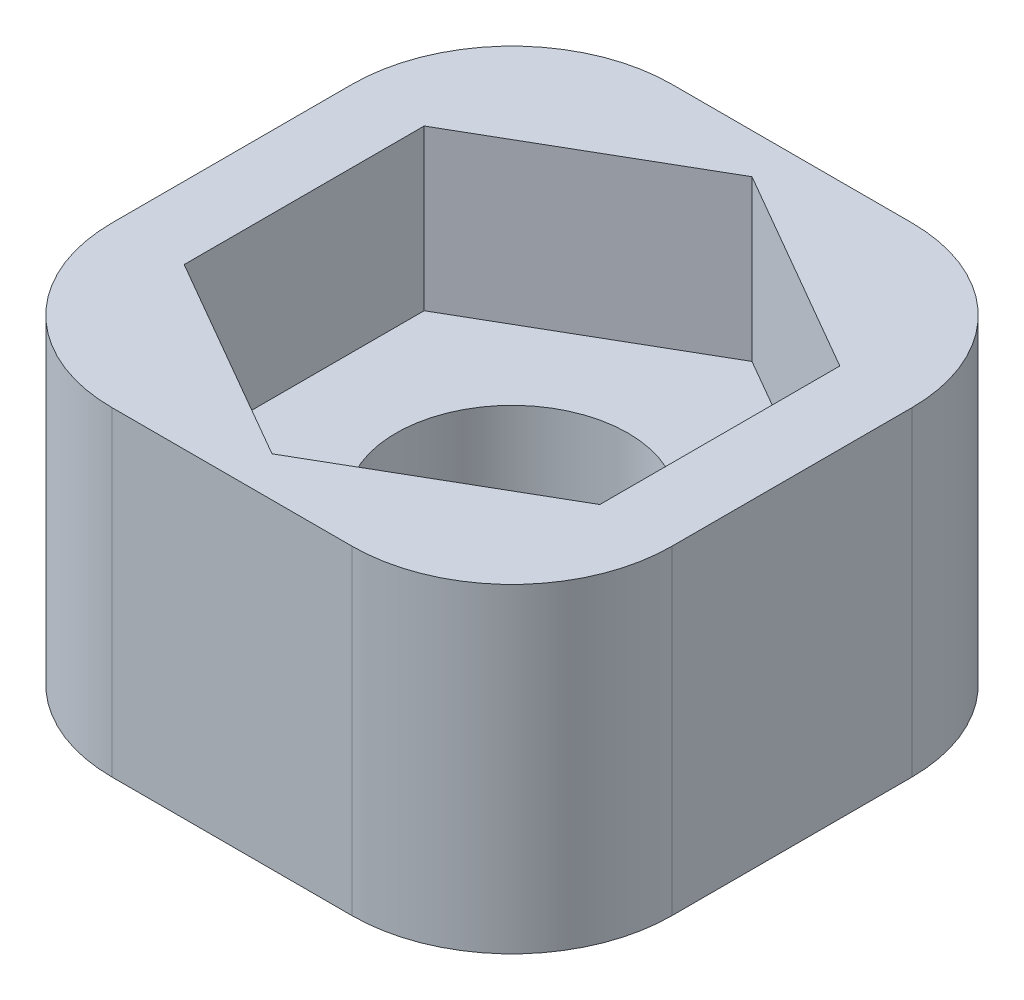
ISO-10303-21;
HEADER;
FILE_DESCRIPTION(('STEP AP214'),'2;1');
FILE_NAME('part.step','',(''),(''),'','','');
FILE_SCHEMA(('AUTOMOTIVE_DESIGN { 1 0 10303 214 1 1 1 1 }'));
ENDSEC;
DATA;
#1=APPLICATION_CONTEXT('core data for automotive mechanical design processes');
#2=APPLICATION_PROTOCOL_DEFINITION('international standard','automotive_design',2000,#1);
#3=PRODUCT_CONTEXT('',#1,'mechanical');
#4=PRODUCT('Part','Part','',(#3));
#5=PRODUCT_RELATED_PRODUCT_CATEGORY('part','',(#4));
#6=PRODUCT_DEFINITION_FORMATION('','',#4);
#7=PRODUCT_DEFINITION_CONTEXT('part definition',#1,'design');
#8=PRODUCT_DEFINITION('design','',#6,#7);
#9=PRODUCT_DEFINITION_SHAPE('','',#8);
#10=(LENGTH_UNIT() NAMED_UNIT(*) SI_UNIT(.MILLI.,.METRE.));
#11=(NAMED_UNIT(*) PLANE_ANGLE_UNIT() SI_UNIT($,.RADIAN.));
#12=(NAMED_UNIT(*) SI_UNIT($,.STERADIAN.) SOLID_ANGLE_UNIT());
#13=UNCERTAINTY_MEASURE_WITH_UNIT(LENGTH_MEASURE(1.E-05),#10,'distance_accuracy_value','');
#14=(GEOMETRIC_REPRESENTATION_CONTEXT(3) GLOBAL_UNCERTAINTY_ASSIGNED_CONTEXT((#13)) GLOBAL_UNIT_ASSIGNED_CONTEXT((#10,
#11,#12)) REPRESENTATION_CONTEXT('',''));
#15=CARTESIAN_POINT('',(0.,0.,0.));
#16=DIRECTION('',(0.,0.,1.));
#17=DIRECTION('',(1.,0.,0.));
#18=AXIS2_PLACEMENT_3D('',#15,#16,#17);
#19=CARTESIAN_POINT('',(3.5,4.,3.5));
#20=DIRECTION('',(-1.,0.,0.));
#21=DIRECTION('',(0.,0.,1.));
#22=AXIS2_PLACEMENT_3D('',#19,#20,#21);
#23=PLANE('',#22);
#24=DIRECTION('',(0.,0.,-1.));
#25=VECTOR('',#24,1.);
#26=CARTESIAN_POINT('',(3.5,4.,3.5));
#27=LINE('',#26,#25);
#28=CARTESIAN_POINT('',(3.5,4.,1.5));
#29=VERTEX_POINT('',#28);
#30=CARTESIAN_POINT('',(3.5,4.,-1.5));
#31=VERTEX_POINT('',#30);
#32=EDGE_CURVE('E207',#29,#31,#27,.T.);
#33=ORIENTED_EDGE('',*,*,#32,.F.);
#34=DIRECTION('',(0.,-1.,0.));
#35=VECTOR('',#34,1.);
#36=CARTESIAN_POINT('',(3.5,4.,1.5));
#37=LINE('',#36,#35);
#38=CARTESIAN_POINT('',(3.5,0.,1.5));
#39=VERTEX_POINT('',#38);
#40=EDGE_CURVE('E229',#29,#39,#37,.T.);
#41=ORIENTED_EDGE('',*,*,#40,.T.);
#42=DIRECTION('',(0.,0.,-1.));
#43=VECTOR('',#42,1.);
#44=CARTESIAN_POINT('',(3.5,0.,3.5));
#45=LINE('',#44,#43);
#46=CARTESIAN_POINT('',(3.5,0.,-1.5));
#47=VERTEX_POINT('',#46);
#48=EDGE_CURVE('E199',#39,#47,#45,.T.);
#49=ORIENTED_EDGE('',*,*,#48,.T.);
#50=DIRECTION('',(0.,-1.,0.));
#51=VECTOR('',#50,1.);
#52=CARTESIAN_POINT('',(3.5,4.,-1.5));
#53=LINE('',#52,#51);
#54=EDGE_CURVE('E218',#47,#31,#53,.F.);
#55=ORIENTED_EDGE('',*,*,#54,.T.);
#56=EDGE_LOOP('',(#33,#41,#49,#55));
#57=FACE_BOUND('',#56,.T.);
#58=ADVANCED_FACE('F43',(#57),#23,.F.);
#59=CARTESIAN_POINT('',(-3.5,4.,-3.5));
#60=DIRECTION('',(0.,0.,1.));
#61=DIRECTION('',(1.,0.,0.));
#62=AXIS2_PLACEMENT_3D('',#59,#60,#61);
#63=PLANE('',#62);
#64=DIRECTION('',(-1.,0.,0.));
#65=VECTOR('',#64,1.);
#66=CARTESIAN_POINT('',(-3.5,0.,-3.5));
#67=LINE('',#66,#65);
#68=CARTESIAN_POINT('',(1.5,0.,-3.5));
#69=VERTEX_POINT('',#68);
#70=CARTESIAN_POINT('',(-1.5,0.,-3.5));
#71=VERTEX_POINT('',#70);
#72=EDGE_CURVE('E221',#69,#71,#67,.T.);
#73=ORIENTED_EDGE('',*,*,#72,.T.);
#74=DIRECTION('',(0.,-1.,0.));
#75=VECTOR('',#74,1.);
#76=CARTESIAN_POINT('',(-1.5,4.,-3.5));
#77=LINE('',#76,#75);
#78=CARTESIAN_POINT('',(-1.5,4.,-3.5));
#79=VERTEX_POINT('',#78);
#80=EDGE_CURVE('E11',#71,#79,#77,.F.);
#81=ORIENTED_EDGE('',*,*,#80,.T.);
#82=DIRECTION('',(-1.,0.,0.));
#83=VECTOR('',#82,1.);
#84=CARTESIAN_POINT('',(-3.5,4.,-3.5));
#85=LINE('',#84,#83);
#86=CARTESIAN_POINT('',(1.5,4.,-3.5));
#87=VERTEX_POINT('',#86);
#88=EDGE_CURVE('E210',#87,#79,#85,.T.);
#89=ORIENTED_EDGE('',*,*,#88,.F.);
#90=DIRECTION('',(0.,-1.,0.));
#91=VECTOR('',#90,1.);
#92=CARTESIAN_POINT('',(1.5,4.,-3.5));
#93=LINE('',#92,#91);
#94=EDGE_CURVE('E51',#87,#69,#93,.T.);
#95=ORIENTED_EDGE('',*,*,#94,.T.);
#96=EDGE_LOOP('',(#73,#81,#89,#95));
#97=FACE_BOUND('',#96,.T.);
#98=ADVANCED_FACE('F260',(#97),#63,.F.);
#99=CARTESIAN_POINT('',(-3.5,4.,3.5));
#100=DIRECTION('',(1.,0.,0.));
#101=DIRECTION('',(0.,0.,-1.));
#102=AXIS2_PLACEMENT_3D('',#99,#100,#101);
#103=PLANE('',#102);
#104=DIRECTION('',(0.,0.,1.));
#105=VECTOR('',#104,1.);
#106=CARTESIAN_POINT('',(-3.5,0.,3.5));
#107=LINE('',#106,#105);
#108=CARTESIAN_POINT('',(-3.5,0.,-1.5));
#109=VERTEX_POINT('',#108);
#110=CARTESIAN_POINT('',(-3.5,0.,1.5));
#111=VERTEX_POINT('',#110);
#112=EDGE_CURVE('E224',#109,#111,#107,.T.);
#113=ORIENTED_EDGE('',*,*,#112,.T.);
#114=DIRECTION('',(0.,-1.,0.));
#115=VECTOR('',#114,1.);
#116=CARTESIAN_POINT('',(-3.5,4.,1.5));
#117=LINE('',#116,#115);
#118=CARTESIAN_POINT('',(-3.5,4.,1.5));
#119=VERTEX_POINT('',#118);
#120=EDGE_CURVE('E58',#111,#119,#117,.F.);
#121=ORIENTED_EDGE('',*,*,#120,.T.);
#122=DIRECTION('',(0.,0.,1.));
#123=VECTOR('',#122,1.);
#124=CARTESIAN_POINT('',(-3.5,4.,3.5));
#125=LINE('',#124,#123);
#126=CARTESIAN_POINT('',(-3.5,4.,-1.5));
#127=VERTEX_POINT('',#126);
#128=EDGE_CURVE('E213',#127,#119,#125,.T.);
#129=ORIENTED_EDGE('',*,*,#128,.F.);
#130=DIRECTION('',(0.,-1.,0.));
#131=VECTOR('',#130,1.);
#132=CARTESIAN_POINT('',(-3.5,4.,-1.5));
#133=LINE('',#132,#131);
#134=EDGE_CURVE('E252',#127,#109,#133,.T.);
#135=ORIENTED_EDGE('',*,*,#134,.T.);
#136=EDGE_LOOP('',(#113,#121,#129,#135));
#137=FACE_BOUND('',#136,.T.);
#138=ADVANCED_FACE('F271',(#137),#103,.F.);
#139=CARTESIAN_POINT('',(-3.5,4.,3.5));
#140=DIRECTION('',(0.,0.,-1.));
#141=DIRECTION('',(-1.,0.,0.));
#142=AXIS2_PLACEMENT_3D('',#139,#140,#141);
#143=PLANE('',#142);
#144=DIRECTION('',(1.,0.,0.));
#145=VECTOR('',#144,1.);
#146=CARTESIAN_POINT('',(-3.5,0.,3.5));
#147=LINE('',#146,#145);
#148=CARTESIAN_POINT('',(-1.5,0.,3.5));
#149=VERTEX_POINT('',#148);
#150=CARTESIAN_POINT('',(1.5,0.,3.5));
#151=VERTEX_POINT('',#150);
#152=EDGE_CURVE('E211',#149,#151,#147,.T.);
#153=ORIENTED_EDGE('',*,*,#152,.T.);
#154=DIRECTION('',(0.,-1.,0.));
#155=VECTOR('',#154,1.);
#156=CARTESIAN_POINT('',(1.5,4.,3.5));
#157=LINE('',#156,#155);
#158=CARTESIAN_POINT('',(1.5,4.,3.5));
#159=VERTEX_POINT('',#158);
#160=EDGE_CURVE('E243',#151,#159,#157,.F.);
#161=ORIENTED_EDGE('',*,*,#160,.T.);
#162=DIRECTION('',(1.,0.,0.));
#163=VECTOR('',#162,1.);
#164=CARTESIAN_POINT('',(-3.5,4.,3.5));
#165=LINE('',#164,#163);
#166=CARTESIAN_POINT('',(-1.5,4.,3.5));
#167=VERTEX_POINT('',#166);
#168=EDGE_CURVE('E215',#167,#159,#165,.T.);
#169=ORIENTED_EDGE('',*,*,#168,.F.);
#170=DIRECTION('',(0.,-1.,0.));
#171=VECTOR('',#170,1.);
#172=CARTESIAN_POINT('',(-1.5,4.,3.5));
#173=LINE('',#172,#171);
#174=EDGE_CURVE('E240',#167,#149,#173,.T.);
#175=ORIENTED_EDGE('',*,*,#174,.T.);
#176=EDGE_LOOP('',(#153,#161,#169,#175));
#177=FACE_BOUND('',#176,.T.);
#178=ADVANCED_FACE('F280',(#177),#143,.F.);
#179=CARTESIAN_POINT('',(0.,4.,0.));
#180=DIRECTION('',(0.,-1.,0.));
#181=DIRECTION('',(0.,0.,-1.));
#182=AXIS2_PLACEMENT_3D('',#179,#180,#181);
#183=PLANE('',#182);
#184=DIRECTION('',(0.,0.,-1.));
#185=VECTOR('',#184,1.);
#186=CARTESIAN_POINT('',(2.59807621135332,4.,1.5));
#187=LINE('',#186,#185);
#188=CARTESIAN_POINT('',(2.59807621135332,4.,1.5));
#189=VERTEX_POINT('',#188);
#190=CARTESIAN_POINT('',(2.59807621135332,4.,-1.5));
#191=VERTEX_POINT('',#190);
#192=EDGE_CURVE('E187',#189,#191,#187,.T.);
#193=ORIENTED_EDGE('',*,*,#192,.F.);
#194=DIRECTION('',(0.866025403784439,0.,-0.5));
#195=VECTOR('',#194,1.);
#196=CARTESIAN_POINT('',(0.,4.,3.));
#197=LINE('',#196,#195);
#198=CARTESIAN_POINT('',(0.,4.,3.));
#199=VERTEX_POINT('',#198);
#200=EDGE_CURVE('E152',#199,#189,#197,.T.);
#201=ORIENTED_EDGE('',*,*,#200,.F.);
#202=DIRECTION('',(0.866025403784439,0.,0.5));
#203=VECTOR('',#202,1.);
#204=CARTESIAN_POINT('',(-2.59807621135332,4.,1.5));
#205=LINE('',#204,#203);
#206=CARTESIAN_POINT('',(-2.59807621135332,4.,1.5));
#207=VERTEX_POINT('',#206);
#208=EDGE_CURVE('E170',#207,#199,#205,.T.);
#209=ORIENTED_EDGE('',*,*,#208,.F.);
#210=DIRECTION('',(0.,0.,1.));
#211=VECTOR('',#210,1.);
#212=CARTESIAN_POINT('',(-2.59807621135332,4.,-1.5));
#213=LINE('',#212,#211);
#214=CARTESIAN_POINT('',(-2.59807621135332,4.,-1.5));
#215=VERTEX_POINT('',#214);
#216=EDGE_CURVE('E173',#215,#207,#213,.T.);
#217=ORIENTED_EDGE('',*,*,#216,.F.);
#218=DIRECTION('',(-0.866025403784439,0.,0.5));
#219=VECTOR('',#218,1.);
#220=CARTESIAN_POINT('',(0.,4.,-3.));
#221=LINE('',#220,#219);
#222=CARTESIAN_POINT('',(0.,4.,-3.));
#223=VERTEX_POINT('',#222);
#224=EDGE_CURVE('E192',#223,#215,#221,.T.);
#225=ORIENTED_EDGE('',*,*,#224,.F.);
#226=DIRECTION('',(-0.866025403784439,0.,-0.5));
#227=VECTOR('',#226,1.);
#228=CARTESIAN_POINT('',(2.59807621135332,4.,-1.5));
#229=LINE('',#228,#227);
#230=EDGE_CURVE('E189',#191,#223,#229,.T.);
#231=ORIENTED_EDGE('',*,*,#230,.F.);
#232=EDGE_LOOP('',(#193,#201,#209,#217,#225,#231));
#233=FACE_BOUND('',#232,.T.);
#234=ORIENTED_EDGE('',*,*,#168,.T.);
#235=CARTESIAN_POINT('',(1.5,4.,1.5));
#236=DIRECTION('',(0.,-1.,0.));
#237=DIRECTION('',(0.,0.,-1.));
#238=AXIS2_PLACEMENT_3D('',#235,#236,#237);
#239=CIRCLE('',#238,2.);
#240=EDGE_CURVE('E250',#159,#29,#239,.F.);
#241=ORIENTED_EDGE('',*,*,#240,.T.);
#242=ORIENTED_EDGE('',*,*,#32,.T.);
#243=CARTESIAN_POINT('',(1.5,4.,-1.5));
#244=DIRECTION('',(0.,-1.,0.));
#245=DIRECTION('',(0.,0.,-1.));
#246=AXIS2_PLACEMENT_3D('',#243,#244,#245);
#247=CIRCLE('',#246,2.);
#248=EDGE_CURVE('E245',#31,#87,#247,.F.);
#249=ORIENTED_EDGE('',*,*,#248,.T.);
#250=ORIENTED_EDGE('',*,*,#88,.T.);
#251=CARTESIAN_POINT('',(-1.5,4.,-1.5));
#252=DIRECTION('',(0.,-1.,0.));
#253=DIRECTION('',(0.,0.,-1.));
#254=AXIS2_PLACEMENT_3D('',#251,#252,#253);
#255=CIRCLE('',#254,2.);
#256=EDGE_CURVE('E65',#79,#127,#255,.F.);
#257=ORIENTED_EDGE('',*,*,#256,.T.);
#258=ORIENTED_EDGE('',*,*,#128,.T.);
#259=CARTESIAN_POINT('',(-1.5,4.,1.5));
#260=DIRECTION('',(0.,-1.,0.));
#261=DIRECTION('',(0.,0.,-1.));
#262=AXIS2_PLACEMENT_3D('',#259,#260,#261);
#263=CIRCLE('',#262,2.);
#264=EDGE_CURVE('E248',#119,#167,#263,.F.);
#265=ORIENTED_EDGE('',*,*,#264,.T.);
#266=EDGE_LOOP('',(#234,#241,#242,#249,#250,#257,#258,#265));
#267=FACE_BOUND('',#266,.T.);
#268=ADVANCED_FACE('F273',(#233,#267),#183,.F.);
#269=CARTESIAN_POINT('',(0.,0.,0.));
#270=DIRECTION('',(0.,-1.,0.));
#271=DIRECTION('',(0.,0.,-1.));
#272=AXIS2_PLACEMENT_3D('',#269,#270,#271);
#273=PLANE('',#272);
#274=CARTESIAN_POINT('',(0.,0.,0.));
#275=DIRECTION('',(0.,-1.,0.));
#276=DIRECTION('',(0.,0.,-1.));
#277=AXIS2_PLACEMENT_3D('',#274,#275,#276);
#278=CIRCLE('',#277,1.45);
#279=CARTESIAN_POINT('',(0.,0.,-1.45));
#280=VERTEX_POINT('',#279);
#281=EDGE_CURVE('E176',#280,#280,#278,.F.);
#282=ORIENTED_EDGE('',*,*,#281,.T.);
#283=EDGE_LOOP('',(#282));
#284=FACE_BOUND('',#283,.T.);
#285=ORIENTED_EDGE('',*,*,#48,.F.);
#286=CARTESIAN_POINT('',(1.5,0.,1.5));
#287=DIRECTION('',(0.,-1.,0.));
#288=DIRECTION('',(0.,0.,-1.));
#289=AXIS2_PLACEMENT_3D('',#286,#287,#288);
#290=CIRCLE('',#289,2.);
#291=EDGE_CURVE('E238',#39,#151,#290,.T.);
#292=ORIENTED_EDGE('',*,*,#291,.T.);
#293=ORIENTED_EDGE('',*,*,#152,.F.);
#294=CARTESIAN_POINT('',(-1.5,0.,1.5));
#295=DIRECTION('',(0.,-1.,0.));
#296=DIRECTION('',(0.,0.,-1.));
#297=AXIS2_PLACEMENT_3D('',#294,#295,#296);
#298=CIRCLE('',#297,2.);
#299=EDGE_CURVE('E236',#149,#111,#298,.T.);
#300=ORIENTED_EDGE('',*,*,#299,.T.);
#301=ORIENTED_EDGE('',*,*,#112,.F.);
#302=CARTESIAN_POINT('',(-1.5,0.,-1.5));
#303=DIRECTION('',(0.,-1.,0.));
#304=DIRECTION('',(0.,0.,-1.));
#305=AXIS2_PLACEMENT_3D('',#302,#303,#304);
#306=CIRCLE('',#305,2.);
#307=EDGE_CURVE('E234',#109,#71,#306,.T.);
#308=ORIENTED_EDGE('',*,*,#307,.T.);
#309=ORIENTED_EDGE('',*,*,#72,.F.);
#310=CARTESIAN_POINT('',(1.5,0.,-1.5));
#311=DIRECTION('',(0.,-1.,0.));
#312=DIRECTION('',(0.,0.,-1.));
#313=AXIS2_PLACEMENT_3D('',#310,#311,#312);
#314=CIRCLE('',#313,2.);
#315=EDGE_CURVE('E232',#69,#47,#314,.T.);
#316=ORIENTED_EDGE('',*,*,#315,.T.);
#317=EDGE_LOOP('',(#285,#292,#293,#300,#301,#308,#309,#316));
#318=FACE_BOUND('',#317,.T.);
#319=ADVANCED_FACE('F266',(#284,#318),#273,.T.);
#320=CARTESIAN_POINT('',(0.,2.,3.));
#321=DIRECTION('',(0.5,0.,0.866025403784439));
#322=DIRECTION('',(0.866025403784439,0.,-0.5));
#323=AXIS2_PLACEMENT_3D('',#320,#321,#322);
#324=PLANE('',#323);
#325=ORIENTED_EDGE('',*,*,#200,.T.);
#326=DIRECTION('',(0.,1.,0.));
#327=VECTOR('',#326,1.);
#328=CARTESIAN_POINT('',(2.59807621135332,2.,1.5));
#329=LINE('',#328,#327);
#330=CARTESIAN_POINT('',(2.59807621135332,2.,1.5));
#331=VERTEX_POINT('',#330);
#332=EDGE_CURVE('E145',#331,#189,#329,.T.);
#333=ORIENTED_EDGE('',*,*,#332,.F.);
#334=DIRECTION('',(0.866025403784439,0.,-0.5));
#335=VECTOR('',#334,1.);
#336=CARTESIAN_POINT('',(0.,2.,3.));
#337=LINE('',#336,#335);
#338=CARTESIAN_POINT('',(0.,2.,3.));
#339=VERTEX_POINT('',#338);
#340=EDGE_CURVE('E149',#339,#331,#337,.T.);
#341=ORIENTED_EDGE('',*,*,#340,.F.);
#342=DIRECTION('',(0.,1.,0.));
#343=VECTOR('',#342,1.);
#344=CARTESIAN_POINT('',(0.,2.,3.));
#345=LINE('',#344,#343);
#346=EDGE_CURVE('E197',#339,#199,#345,.T.);
#347=ORIENTED_EDGE('',*,*,#346,.T.);
#348=EDGE_LOOP('',(#325,#333,#341,#347));
#349=FACE_BOUND('',#348,.T.);
#350=ADVANCED_FACE('F147',(#349),#324,.F.);
#351=CARTESIAN_POINT('',(-2.59807621135332,2.,1.5));
#352=DIRECTION('',(-0.5,0.,0.866025403784439));
#353=DIRECTION('',(0.866025403784439,0.,0.5));
#354=AXIS2_PLACEMENT_3D('',#351,#352,#353);
#355=PLANE('',#354);
#356=ORIENTED_EDGE('',*,*,#208,.T.);
#357=ORIENTED_EDGE('',*,*,#346,.F.);
#358=DIRECTION('',(0.866025403784439,0.,0.5));
#359=VECTOR('',#358,1.);
#360=CARTESIAN_POINT('',(-2.59807621135332,2.,1.5));
#361=LINE('',#360,#359);
#362=CARTESIAN_POINT('',(-2.59807621135332,2.,1.5));
#363=VERTEX_POINT('',#362);
#364=EDGE_CURVE('E157',#363,#339,#361,.T.);
#365=ORIENTED_EDGE('',*,*,#364,.F.);
#366=DIRECTION('',(0.,1.,0.));
#367=VECTOR('',#366,1.);
#368=CARTESIAN_POINT('',(-2.59807621135332,2.,1.5));
#369=LINE('',#368,#367);
#370=EDGE_CURVE('E200',#363,#207,#369,.T.);
#371=ORIENTED_EDGE('',*,*,#370,.T.);
#372=EDGE_LOOP('',(#356,#357,#365,#371));
#373=FACE_BOUND('',#372,.T.);
#374=ADVANCED_FACE('F375',(#373),#355,.F.);
#375=CARTESIAN_POINT('',(-2.59807621135332,2.,-1.5));
#376=DIRECTION('',(-1.,0.,0.));
#377=DIRECTION('',(0.,0.,1.));
#378=AXIS2_PLACEMENT_3D('',#375,#376,#377);
#379=PLANE('',#378);
#380=ORIENTED_EDGE('',*,*,#216,.T.);
#381=ORIENTED_EDGE('',*,*,#370,.F.);
#382=DIRECTION('',(0.,0.,1.));
#383=VECTOR('',#382,1.);
#384=CARTESIAN_POINT('',(-2.59807621135332,2.,-1.5));
#385=LINE('',#384,#383);
#386=CARTESIAN_POINT('',(-2.59807621135332,2.,-1.5));
#387=VERTEX_POINT('',#386);
#388=EDGE_CURVE('E183',#387,#363,#385,.T.);
#389=ORIENTED_EDGE('',*,*,#388,.F.);
#390=DIRECTION('',(0.,1.,0.));
#391=VECTOR('',#390,1.);
#392=CARTESIAN_POINT('',(-2.59807621135332,2.,-1.5));
#393=LINE('',#392,#391);
#394=EDGE_CURVE('E202',#387,#215,#393,.T.);
#395=ORIENTED_EDGE('',*,*,#394,.T.);
#396=EDGE_LOOP('',(#380,#381,#389,#395));
#397=FACE_BOUND('',#396,.T.);
#398=ADVANCED_FACE('F366',(#397),#379,.F.);
#399=CARTESIAN_POINT('',(0.,2.,-3.));
#400=DIRECTION('',(-0.5,0.,-0.866025403784439));
#401=DIRECTION('',(-0.866025403784439,0.,0.5));
#402=AXIS2_PLACEMENT_3D('',#399,#400,#401);
#403=PLANE('',#402);
#404=ORIENTED_EDGE('',*,*,#224,.T.);
#405=ORIENTED_EDGE('',*,*,#394,.F.);
#406=DIRECTION('',(-0.866025403784439,0.,0.5));
#407=VECTOR('',#406,1.);
#408=CARTESIAN_POINT('',(0.,2.,-3.));
#409=LINE('',#408,#407);
#410=CARTESIAN_POINT('',(0.,2.,-3.));
#411=VERTEX_POINT('',#410);
#412=EDGE_CURVE('E180',#411,#387,#409,.T.);
#413=ORIENTED_EDGE('',*,*,#412,.F.);
#414=DIRECTION('',(0.,1.,0.));
#415=VECTOR('',#414,1.);
#416=CARTESIAN_POINT('',(0.,2.,-3.));
#417=LINE('',#416,#415);
#418=EDGE_CURVE('E204',#411,#223,#417,.T.);
#419=ORIENTED_EDGE('',*,*,#418,.T.);
#420=EDGE_LOOP('',(#404,#405,#413,#419));
#421=FACE_BOUND('',#420,.T.);
#422=ADVANCED_FACE('F357',(#421),#403,.F.);
#423=CARTESIAN_POINT('',(2.59807621135332,2.,-1.5));
#424=DIRECTION('',(0.5,0.,-0.866025403784439));
#425=DIRECTION('',(-0.866025403784439,0.,-0.5));
#426=AXIS2_PLACEMENT_3D('',#423,#424,#425);
#427=PLANE('',#426);
#428=ORIENTED_EDGE('',*,*,#230,.T.);
#429=ORIENTED_EDGE('',*,*,#418,.F.);
#430=DIRECTION('',(-0.866025403784439,0.,-0.5));
#431=VECTOR('',#430,1.);
#432=CARTESIAN_POINT('',(2.59807621135332,2.,-1.5));
#433=LINE('',#432,#431);
#434=CARTESIAN_POINT('',(2.59807621135332,2.,-1.5));
#435=VERTEX_POINT('',#434);
#436=EDGE_CURVE('E165',#435,#411,#433,.T.);
#437=ORIENTED_EDGE('',*,*,#436,.F.);
#438=DIRECTION('',(0.,1.,0.));
#439=VECTOR('',#438,1.);
#440=CARTESIAN_POINT('',(2.59807621135332,2.,-1.5));
#441=LINE('',#440,#439);
#442=EDGE_CURVE('E156',#435,#191,#441,.T.);
#443=ORIENTED_EDGE('',*,*,#442,.T.);
#444=EDGE_LOOP('',(#428,#429,#437,#443));
#445=FACE_BOUND('',#444,.T.);
#446=ADVANCED_FACE('F349',(#445),#427,.F.);
#447=CARTESIAN_POINT('',(2.59807621135332,2.,1.5));
#448=DIRECTION('',(1.,0.,0.));
#449=DIRECTION('',(0.,0.,-1.));
#450=AXIS2_PLACEMENT_3D('',#447,#448,#449);
#451=PLANE('',#450);
#452=ORIENTED_EDGE('',*,*,#192,.T.);
#453=ORIENTED_EDGE('',*,*,#442,.F.);
#454=DIRECTION('',(0.,0.,-1.));
#455=VECTOR('',#454,1.);
#456=CARTESIAN_POINT('',(2.59807621135332,2.,1.5));
#457=LINE('',#456,#455);
#458=EDGE_CURVE('E160',#331,#435,#457,.T.);
#459=ORIENTED_EDGE('',*,*,#458,.F.);
#460=ORIENTED_EDGE('',*,*,#332,.T.);
#461=EDGE_LOOP('',(#452,#453,#459,#460));
#462=FACE_BOUND('',#461,.T.);
#463=ADVANCED_FACE('F161',(#462),#451,.F.);
#464=CARTESIAN_POINT('',(0.,2.,0.));
#465=DIRECTION('',(0.,1.,0.));
#466=DIRECTION('',(0.,0.,1.));
#467=AXIS2_PLACEMENT_3D('',#464,#465,#466);
#468=PLANE('',#467);
#469=CARTESIAN_POINT('',(0.,2.,0.));
#470=DIRECTION('',(0.,1.,0.));
#471=DIRECTION('',(0.,0.,1.));
#472=AXIS2_PLACEMENT_3D('',#469,#470,#471);
#473=CIRCLE('',#472,1.45);
#474=CARTESIAN_POINT('',(0.,2.,1.45));
#475=VERTEX_POINT('',#474);
#476=EDGE_CURVE('E445',#475,#475,#473,.T.);
#477=ORIENTED_EDGE('',*,*,#476,.F.);
#478=EDGE_LOOP('',(#477));
#479=FACE_BOUND('',#478,.T.);
#480=ORIENTED_EDGE('',*,*,#340,.T.);
#481=ORIENTED_EDGE('',*,*,#458,.T.);
#482=ORIENTED_EDGE('',*,*,#436,.T.);
#483=ORIENTED_EDGE('',*,*,#412,.T.);
#484=ORIENTED_EDGE('',*,*,#388,.T.);
#485=ORIENTED_EDGE('',*,*,#364,.T.);
#486=EDGE_LOOP('',(#480,#481,#482,#483,#484,#485));
#487=FACE_BOUND('',#486,.T.);
#488=ADVANCED_FACE('F167',(#479,#487),#468,.T.);
#489=CARTESIAN_POINT('',(0.,-4.10121933088197,0.));
#490=DIRECTION('',(0.,1.,0.));
#491=DIRECTION('',(0.,0.,1.));
#492=AXIS2_PLACEMENT_3D('',#489,#490,#491);
#493=CYLINDRICAL_SURFACE('',#492,1.45);
#494=ORIENTED_EDGE('',*,*,#476,.T.);
#495=EDGE_LOOP('',(#494));
#496=FACE_BOUND('',#495,.T.);
#497=ORIENTED_EDGE('',*,*,#281,.F.);
#498=EDGE_LOOP('',(#497));
#499=FACE_BOUND('',#498,.T.);
#500=ADVANCED_FACE('F304',(#496,#499),#493,.F.);
#501=CARTESIAN_POINT('',(1.5,4.,1.5));
#502=DIRECTION('',(0.,-1.,0.));
#503=DIRECTION('',(0.,0.,-1.));
#504=AXIS2_PLACEMENT_3D('',#501,#502,#503);
#505=CYLINDRICAL_SURFACE('',#504,2.);
#506=ORIENTED_EDGE('',*,*,#240,.F.);
#507=ORIENTED_EDGE('',*,*,#160,.F.);
#508=ORIENTED_EDGE('',*,*,#291,.F.);
#509=ORIENTED_EDGE('',*,*,#40,.F.);
#510=EDGE_LOOP('',(#506,#507,#508,#509));
#511=FACE_BOUND('',#510,.T.);
#512=ADVANCED_FACE('F285',(#511),#505,.T.);
#513=CARTESIAN_POINT('',(-1.5,4.,1.5));
#514=DIRECTION('',(0.,-1.,0.));
#515=DIRECTION('',(0.,0.,-1.));
#516=AXIS2_PLACEMENT_3D('',#513,#514,#515);
#517=CYLINDRICAL_SURFACE('',#516,2.);
#518=ORIENTED_EDGE('',*,*,#264,.F.);
#519=ORIENTED_EDGE('',*,*,#120,.F.);
#520=ORIENTED_EDGE('',*,*,#299,.F.);
#521=ORIENTED_EDGE('',*,*,#174,.F.);
#522=EDGE_LOOP('',(#518,#519,#520,#521));
#523=FACE_BOUND('',#522,.T.);
#524=ADVANCED_FACE('F277',(#523),#517,.T.);
#525=CARTESIAN_POINT('',(-1.5,4.,-1.5));
#526=DIRECTION('',(0.,-1.,0.));
#527=DIRECTION('',(0.,0.,-1.));
#528=AXIS2_PLACEMENT_3D('',#525,#526,#527);
#529=CYLINDRICAL_SURFACE('',#528,2.);
#530=ORIENTED_EDGE('',*,*,#256,.F.);
#531=ORIENTED_EDGE('',*,*,#80,.F.);
#532=ORIENTED_EDGE('',*,*,#307,.F.);
#533=ORIENTED_EDGE('',*,*,#134,.F.);
#534=EDGE_LOOP('',(#530,#531,#532,#533));
#535=FACE_BOUND('',#534,.T.);
#536=ADVANCED_FACE('F270',(#535),#529,.T.);
#537=CARTESIAN_POINT('',(1.5,4.,-1.5));
#538=DIRECTION('',(0.,-1.,0.));
#539=DIRECTION('',(0.,0.,-1.));
#540=AXIS2_PLACEMENT_3D('',#537,#538,#539);
#541=CYLINDRICAL_SURFACE('',#540,2.);
#542=ORIENTED_EDGE('',*,*,#248,.F.);
#543=ORIENTED_EDGE('',*,*,#54,.F.);
#544=ORIENTED_EDGE('',*,*,#315,.F.);
#545=ORIENTED_EDGE('',*,*,#94,.F.);
#546=EDGE_LOOP('',(#542,#543,#544,#545));
#547=FACE_BOUND('',#546,.T.);
#548=ADVANCED_FACE('F45',(#547),#541,.T.);
#549=CLOSED_SHELL('',(#58,#98,#138,#178,#268,#319,#350,#374,#398,#422,#446,#463,#488,#500,#512,
#524,#536,#548));
#550=MANIFOLD_SOLID_BREP('B2',#549);
#551=ADVANCED_BREP_SHAPE_REPRESENTATION('',(#18,#550),#14);
#552=SHAPE_DEFINITION_REPRESENTATION(#9,#551);
ENDSEC;
END-ISO-10303-21;
